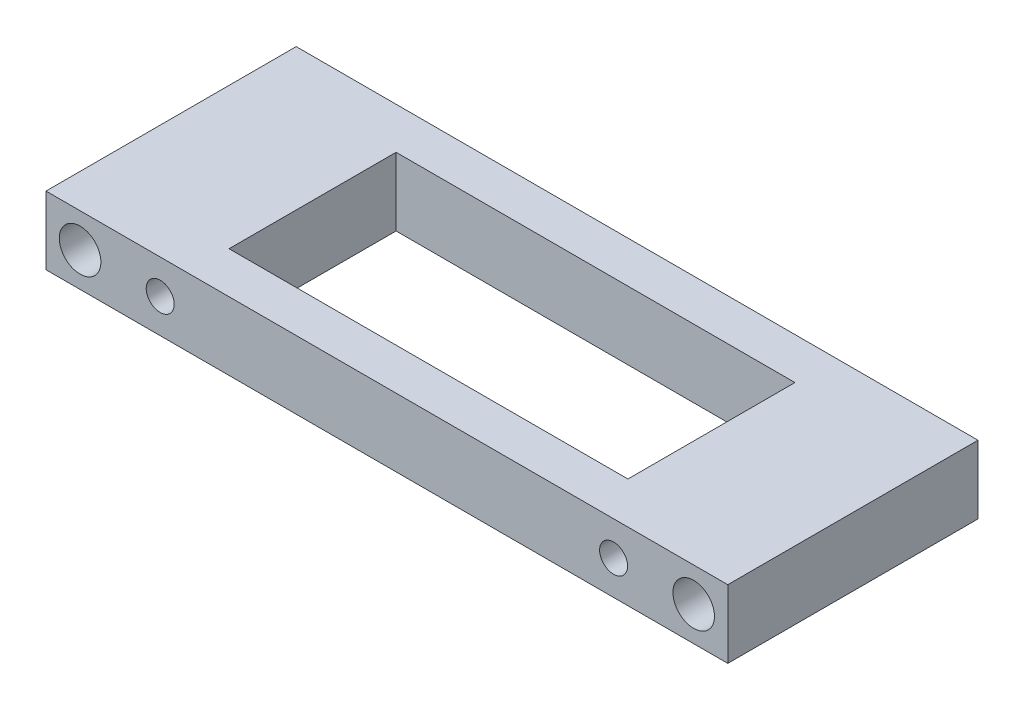
ISO-10303-21;
HEADER;
FILE_DESCRIPTION(('STEP AP214'),'2;1');
FILE_NAME('part.step','',(''),(''),'','','');
FILE_SCHEMA(('AUTOMOTIVE_DESIGN { 1 0 10303 214 1 1 1 1 }'));
ENDSEC;
DATA;
#1=APPLICATION_CONTEXT('core data for automotive mechanical design processes');
#2=APPLICATION_PROTOCOL_DEFINITION('international standard','automotive_design',2000,#1);
#3=PRODUCT_CONTEXT('',#1,'mechanical');
#4=PRODUCT('Part','Part','',(#3));
#5=PRODUCT_RELATED_PRODUCT_CATEGORY('part','',(#4));
#6=PRODUCT_DEFINITION_FORMATION('','',#4);
#7=PRODUCT_DEFINITION_CONTEXT('part definition',#1,'design');
#8=PRODUCT_DEFINITION('design','',#6,#7);
#9=PRODUCT_DEFINITION_SHAPE('','',#8);
#10=(LENGTH_UNIT() NAMED_UNIT(*) SI_UNIT(.MILLI.,.METRE.));
#11=(NAMED_UNIT(*) PLANE_ANGLE_UNIT() SI_UNIT($,.RADIAN.));
#12=(NAMED_UNIT(*) SI_UNIT($,.STERADIAN.) SOLID_ANGLE_UNIT());
#13=UNCERTAINTY_MEASURE_WITH_UNIT(LENGTH_MEASURE(1.E-05),#10,'distance_accuracy_value','');
#14=(GEOMETRIC_REPRESENTATION_CONTEXT(3) GLOBAL_UNCERTAINTY_ASSIGNED_CONTEXT((#13)) GLOBAL_UNIT_ASSIGNED_CONTEXT((#10,
#11,#12)) REPRESENTATION_CONTEXT('',''));
#15=CARTESIAN_POINT('',(0.,0.,0.));
#16=DIRECTION('',(0.,0.,1.));
#17=DIRECTION('',(1.,0.,0.));
#18=AXIS2_PLACEMENT_3D('',#15,#16,#17);
#19=CARTESIAN_POINT('',(0.,20.,40.));
#20=DIRECTION('',(0.,-1.,0.));
#21=DIRECTION('',(1.,0.,0.));
#22=AXIS2_PLACEMENT_3D('',#19,#20,#21);
#23=PLANE('',#22);
#24=DIRECTION('',(0.,0.,-1.));
#25=VECTOR('',#24,1.);
#26=CARTESIAN_POINT('',(100.,20.,40.));
#27=LINE('',#26,#25);
#28=CARTESIAN_POINT('',(100.,20.,40.));
#29=VERTEX_POINT('',#28);
#30=CARTESIAN_POINT('',(100.,20.,-33.4));
#31=VERTEX_POINT('',#30);
#32=EDGE_CURVE('E145',#29,#31,#27,.T.);
#33=ORIENTED_EDGE('',*,*,#32,.T.);
#34=DIRECTION('',(1.,0.,0.));
#35=VECTOR('',#34,1.);
#36=CARTESIAN_POINT('',(-100.,20.,-33.4));
#37=LINE('',#36,#35);
#38=CARTESIAN_POINT('',(-100.,20.,-33.4));
#39=VERTEX_POINT('',#38);
#40=EDGE_CURVE('E164',#39,#31,#37,.T.);
#41=ORIENTED_EDGE('',*,*,#40,.F.);
#42=DIRECTION('',(0.,0.,-1.));
#43=VECTOR('',#42,1.);
#44=CARTESIAN_POINT('',(-100.,20.,40.));
#45=LINE('',#44,#43);
#46=CARTESIAN_POINT('',(-100.,20.,40.));
#47=VERTEX_POINT('',#46);
#48=EDGE_CURVE('E11',#47,#39,#45,.T.);
#49=ORIENTED_EDGE('',*,*,#48,.F.);
#50=DIRECTION('',(-1.,0.,0.));
#51=VECTOR('',#50,1.);
#52=CARTESIAN_POINT('',(0.,20.,40.));
#53=LINE('',#52,#51);
#54=EDGE_CURVE('E179',#29,#47,#53,.T.);
#55=ORIENTED_EDGE('',*,*,#54,.F.);
#56=EDGE_LOOP('',(#33,#41,#49,#55));
#57=FACE_BOUND('',#56,.T.);
#58=DIRECTION('',(-1.,0.,0.));
#59=VECTOR('',#58,1.);
#60=CARTESIAN_POINT('',(0.,20.,-21.2));
#61=LINE('',#60,#59);
#62=CARTESIAN_POINT('',(58.5,20.,-21.2));
#63=VERTEX_POINT('',#62);
#64=CARTESIAN_POINT('',(-58.5,20.,-21.2));
#65=VERTEX_POINT('',#64);
#66=EDGE_CURVE('E153',#63,#65,#61,.T.);
#67=ORIENTED_EDGE('',*,*,#66,.F.);
#68=DIRECTION('',(0.,0.,1.));
#69=VECTOR('',#68,1.);
#70=CARTESIAN_POINT('',(58.5,20.,-21.2));
#71=LINE('',#70,#69);
#72=CARTESIAN_POINT('',(58.5,20.,27.8));
#73=VERTEX_POINT('',#72);
#74=EDGE_CURVE('E117',#63,#73,#71,.T.);
#75=ORIENTED_EDGE('',*,*,#74,.T.);
#76=DIRECTION('',(1.,0.,0.));
#77=VECTOR('',#76,1.);
#78=CARTESIAN_POINT('',(0.,20.,27.8));
#79=LINE('',#78,#77);
#80=CARTESIAN_POINT('',(-58.5,20.,27.8));
#81=VERTEX_POINT('',#80);
#82=EDGE_CURVE('E158',#81,#73,#79,.T.);
#83=ORIENTED_EDGE('',*,*,#82,.F.);
#84=DIRECTION('',(0.,0.,1.));
#85=VECTOR('',#84,1.);
#86=CARTESIAN_POINT('',(-58.5,20.,-21.2));
#87=LINE('',#86,#85);
#88=EDGE_CURVE('E155',#65,#81,#87,.T.);
#89=ORIENTED_EDGE('',*,*,#88,.F.);
#90=EDGE_LOOP('',(#67,#75,#83,#89));
#91=FACE_BOUND('',#90,.T.);
#92=ADVANCED_FACE('F35',(#57,#91),#23,.F.);
#93=CARTESIAN_POINT('',(0.,0.,40.));
#94=DIRECTION('',(0.,1.,0.));
#95=DIRECTION('',(0.,0.,1.));
#96=AXIS2_PLACEMENT_3D('',#93,#94,#95);
#97=PLANE('',#96);
#98=DIRECTION('',(-1.,0.,0.));
#99=VECTOR('',#98,1.);
#100=CARTESIAN_POINT('',(-100.,0.,-33.4));
#101=LINE('',#100,#99);
#102=CARTESIAN_POINT('',(100.,0.,-33.4));
#103=VERTEX_POINT('',#102);
#104=CARTESIAN_POINT('',(-100.,0.,-33.4));
#105=VERTEX_POINT('',#104);
#106=EDGE_CURVE('E166',#103,#105,#101,.T.);
#107=ORIENTED_EDGE('',*,*,#106,.F.);
#108=DIRECTION('',(0.,0.,-1.));
#109=VECTOR('',#108,1.);
#110=CARTESIAN_POINT('',(100.,0.,40.));
#111=LINE('',#110,#109);
#112=CARTESIAN_POINT('',(100.,0.,40.));
#113=VERTEX_POINT('',#112);
#114=EDGE_CURVE('E148',#113,#103,#111,.T.);
#115=ORIENTED_EDGE('',*,*,#114,.F.);
#116=DIRECTION('',(1.,0.,0.));
#117=VECTOR('',#116,1.);
#118=CARTESIAN_POINT('',(0.,0.,40.));
#119=LINE('',#118,#117);
#120=CARTESIAN_POINT('',(-100.,0.,40.));
#121=VERTEX_POINT('',#120);
#122=EDGE_CURVE('E184',#121,#113,#119,.T.);
#123=ORIENTED_EDGE('',*,*,#122,.F.);
#124=DIRECTION('',(0.,0.,-1.));
#125=VECTOR('',#124,1.);
#126=CARTESIAN_POINT('',(-100.,0.,40.));
#127=LINE('',#126,#125);
#128=EDGE_CURVE('E42',#121,#105,#127,.T.);
#129=ORIENTED_EDGE('',*,*,#128,.T.);
#130=EDGE_LOOP('',(#107,#115,#123,#129));
#131=FACE_BOUND('',#130,.T.);
#132=DIRECTION('',(0.,0.,-1.));
#133=VECTOR('',#132,1.);
#134=CARTESIAN_POINT('',(58.5,0.,-21.2));
#135=LINE('',#134,#133);
#136=CARTESIAN_POINT('',(58.5,0.,27.8));
#137=VERTEX_POINT('',#136);
#138=CARTESIAN_POINT('',(58.5,0.,-21.2));
#139=VERTEX_POINT('',#138);
#140=EDGE_CURVE('E114',#137,#139,#135,.T.);
#141=ORIENTED_EDGE('',*,*,#140,.T.);
#142=DIRECTION('',(1.,0.,0.));
#143=VECTOR('',#142,1.);
#144=CARTESIAN_POINT('',(0.,0.,-21.2));
#145=LINE('',#144,#143);
#146=CARTESIAN_POINT('',(-58.5,0.,-21.2));
#147=VERTEX_POINT('',#146);
#148=EDGE_CURVE('E98',#147,#139,#145,.T.);
#149=ORIENTED_EDGE('',*,*,#148,.F.);
#150=DIRECTION('',(0.,0.,-1.));
#151=VECTOR('',#150,1.);
#152=CARTESIAN_POINT('',(-58.5,0.,-21.2));
#153=LINE('',#152,#151);
#154=CARTESIAN_POINT('',(-58.5,0.,27.8));
#155=VERTEX_POINT('',#154);
#156=EDGE_CURVE('E49',#155,#147,#153,.T.);
#157=ORIENTED_EDGE('',*,*,#156,.F.);
#158=DIRECTION('',(-1.,0.,0.));
#159=VECTOR('',#158,1.);
#160=CARTESIAN_POINT('',(0.,0.,27.8));
#161=LINE('',#160,#159);
#162=EDGE_CURVE('E123',#137,#155,#161,.T.);
#163=ORIENTED_EDGE('',*,*,#162,.F.);
#164=EDGE_LOOP('',(#141,#149,#157,#163));
#165=FACE_BOUND('',#164,.T.);
#166=ADVANCED_FACE('F121',(#131,#165),#97,.F.);
#167=CARTESIAN_POINT('',(0.,0.,40.));
#168=DIRECTION('',(0.,0.,1.));
#169=DIRECTION('',(1.,0.,0.));
#170=AXIS2_PLACEMENT_3D('',#167,#168,#169);
#171=PLANE('',#170);
#172=CARTESIAN_POINT('',(-90.,9.99999999999999,40.));
#173=DIRECTION('',(0.,0.,1.));
#174=DIRECTION('',(1.,0.,0.));
#175=AXIS2_PLACEMENT_3D('',#172,#173,#174);
#176=CIRCLE('',#175,6.1);
#177=CARTESIAN_POINT('',(-83.9,9.99999999999999,40.));
#178=VERTEX_POINT('',#177);
#179=EDGE_CURVE('E176',#178,#178,#176,.T.);
#180=ORIENTED_EDGE('',*,*,#179,.F.);
#181=EDGE_LOOP('',(#180));
#182=FACE_BOUND('',#181,.T.);
#183=ORIENTED_EDGE('',*,*,#122,.T.);
#184=DIRECTION('',(0.,-1.,0.));
#185=VECTOR('',#184,1.);
#186=CARTESIAN_POINT('',(100.,0.,40.));
#187=LINE('',#186,#185);
#188=EDGE_CURVE('E142',#29,#113,#187,.T.);
#189=ORIENTED_EDGE('',*,*,#188,.F.);
#190=ORIENTED_EDGE('',*,*,#54,.T.);
#191=DIRECTION('',(0.,-1.,0.));
#192=VECTOR('',#191,1.);
#193=CARTESIAN_POINT('',(-100.,0.,40.));
#194=LINE('',#193,#192);
#195=EDGE_CURVE('E57',#47,#121,#194,.T.);
#196=ORIENTED_EDGE('',*,*,#195,.T.);
#197=EDGE_LOOP('',(#183,#189,#190,#196));
#198=FACE_BOUND('',#197,.T.);
#199=CARTESIAN_POINT('',(-66.5,9.99999999999999,40.));
#200=DIRECTION('',(0.,0.,1.));
#201=DIRECTION('',(1.,0.,0.));
#202=AXIS2_PLACEMENT_3D('',#199,#200,#201);
#203=CIRCLE('',#202,4.1);
#204=CARTESIAN_POINT('',(-62.4,9.99999999999999,40.));
#205=VERTEX_POINT('',#204);
#206=EDGE_CURVE('E170',#205,#205,#203,.T.);
#207=ORIENTED_EDGE('',*,*,#206,.F.);
#208=EDGE_LOOP('',(#207));
#209=FACE_BOUND('',#208,.T.);
#210=CARTESIAN_POINT('',(66.5,9.99999999999999,40.));
#211=DIRECTION('',(0.,0.,-1.));
#212=DIRECTION('',(-1.,0.,0.));
#213=AXIS2_PLACEMENT_3D('',#210,#211,#212);
#214=CIRCLE('',#213,4.1);
#215=CARTESIAN_POINT('',(62.4,9.99999999999999,40.));
#216=VERTEX_POINT('',#215);
#217=EDGE_CURVE('E136',#216,#216,#214,.T.);
#218=ORIENTED_EDGE('',*,*,#217,.T.);
#219=EDGE_LOOP('',(#218));
#220=FACE_BOUND('',#219,.T.);
#221=CARTESIAN_POINT('',(90.,9.99999999999999,40.));
#222=DIRECTION('',(0.,0.,-1.));
#223=DIRECTION('',(-1.,0.,0.));
#224=AXIS2_PLACEMENT_3D('',#221,#222,#223);
#225=CIRCLE('',#224,6.1);
#226=CARTESIAN_POINT('',(83.9,9.99999999999999,40.));
#227=VERTEX_POINT('',#226);
#228=EDGE_CURVE('E139',#227,#227,#225,.T.);
#229=ORIENTED_EDGE('',*,*,#228,.T.);
#230=EDGE_LOOP('',(#229));
#231=FACE_BOUND('',#230,.T.);
#232=ADVANCED_FACE('F202',(#182,#198,#209,#220,#231),#171,.T.);
#233=CARTESIAN_POINT('',(-100.,0.,40.));
#234=DIRECTION('',(1.,0.,0.));
#235=DIRECTION('',(0.,0.,-1.));
#236=AXIS2_PLACEMENT_3D('',#233,#234,#235);
#237=PLANE('',#236);
#238=ORIENTED_EDGE('',*,*,#48,.T.);
#239=DIRECTION('',(0.,1.,0.));
#240=VECTOR('',#239,1.);
#241=CARTESIAN_POINT('',(-100.,20.,-33.4));
#242=LINE('',#241,#240);
#243=EDGE_CURVE('E107',#105,#39,#242,.T.);
#244=ORIENTED_EDGE('',*,*,#243,.F.);
#245=ORIENTED_EDGE('',*,*,#128,.F.);
#246=ORIENTED_EDGE('',*,*,#195,.F.);
#247=EDGE_LOOP('',(#238,#244,#245,#246));
#248=FACE_BOUND('',#247,.T.);
#249=ADVANCED_FACE('F193',(#248),#237,.F.);
#250=CARTESIAN_POINT('',(-90.,9.99999999999999,40.));
#251=DIRECTION('',(0.,0.,-1.));
#252=DIRECTION('',(-1.,0.,0.));
#253=AXIS2_PLACEMENT_3D('',#250,#251,#252);
#254=CYLINDRICAL_SURFACE('',#253,6.1);
#255=ORIENTED_EDGE('',*,*,#179,.T.);
#256=EDGE_LOOP('',(#255));
#257=FACE_BOUND('',#256,.T.);
#258=CARTESIAN_POINT('',(-90.,9.99999999999999,0.));
#259=DIRECTION('',(0.,0.,1.));
#260=DIRECTION('',(1.,0.,0.));
#261=AXIS2_PLACEMENT_3D('',#258,#259,#260);
#262=CIRCLE('',#261,6.1);
#263=CARTESIAN_POINT('',(-83.9,9.99999999999999,0.));
#264=VERTEX_POINT('',#263);
#265=EDGE_CURVE('E173',#264,#264,#262,.T.);
#266=ORIENTED_EDGE('',*,*,#265,.F.);
#267=EDGE_LOOP('',(#266));
#268=FACE_BOUND('',#267,.T.);
#269=ADVANCED_FACE('F240',(#257,#268),#254,.F.);
#270=CARTESIAN_POINT('',(-66.5,9.99999999999999,40.));
#271=DIRECTION('',(0.,0.,-1.));
#272=DIRECTION('',(-1.,0.,0.));
#273=AXIS2_PLACEMENT_3D('',#270,#271,#272);
#274=CYLINDRICAL_SURFACE('',#273,4.1);
#275=ORIENTED_EDGE('',*,*,#206,.T.);
#276=EDGE_LOOP('',(#275));
#277=FACE_BOUND('',#276,.T.);
#278=CARTESIAN_POINT('',(-66.5,9.99999999999999,0.));
#279=DIRECTION('',(0.,0.,1.));
#280=DIRECTION('',(1.,0.,0.));
#281=AXIS2_PLACEMENT_3D('',#278,#279,#280);
#282=CIRCLE('',#281,4.1);
#283=CARTESIAN_POINT('',(-62.4,9.99999999999999,0.));
#284=VERTEX_POINT('',#283);
#285=EDGE_CURVE('E169',#284,#284,#282,.T.);
#286=ORIENTED_EDGE('',*,*,#285,.F.);
#287=EDGE_LOOP('',(#286));
#288=FACE_BOUND('',#287,.T.);
#289=ADVANCED_FACE('F244',(#277,#288),#274,.F.);
#290=CARTESIAN_POINT('',(0.,0.,0.));
#291=DIRECTION('',(0.,0.,1.));
#292=DIRECTION('',(1.,0.,0.));
#293=AXIS2_PLACEMENT_3D('',#290,#291,#292);
#294=PLANE('',#293);
#295=ORIENTED_EDGE('',*,*,#285,.T.);
#296=EDGE_LOOP('',(#295));
#297=FACE_BOUND('',#296,.T.);
#298=ADVANCED_FACE('F249',(#297),#294,.T.);
#299=ORIENTED_EDGE('',*,*,#265,.T.);
#300=EDGE_LOOP('',(#299));
#301=FACE_BOUND('',#300,.T.);
#302=ADVANCED_FACE('F254',(#301),#294,.T.);
#303=CARTESIAN_POINT('',(0.,0.,-33.4));
#304=DIRECTION('',(0.,0.,1.));
#305=DIRECTION('',(1.,0.,0.));
#306=AXIS2_PLACEMENT_3D('',#303,#304,#305);
#307=PLANE('',#306);
#308=ORIENTED_EDGE('',*,*,#243,.T.);
#309=ORIENTED_EDGE('',*,*,#40,.T.);
#310=DIRECTION('',(0.,1.,0.));
#311=VECTOR('',#310,1.);
#312=CARTESIAN_POINT('',(100.,20.,-33.4));
#313=LINE('',#312,#311);
#314=EDGE_CURVE('E118',#103,#31,#313,.T.);
#315=ORIENTED_EDGE('',*,*,#314,.F.);
#316=ORIENTED_EDGE('',*,*,#106,.T.);
#317=EDGE_LOOP('',(#308,#309,#315,#316));
#318=FACE_BOUND('',#317,.T.);
#319=ADVANCED_FACE('F192',(#318),#307,.F.);
#320=CARTESIAN_POINT('',(0.,-0.001000000000001,27.8));
#321=DIRECTION('',(0.,0.,1.));
#322=DIRECTION('',(1.,0.,0.));
#323=AXIS2_PLACEMENT_3D('',#320,#321,#322);
#324=PLANE('',#323);
#325=ORIENTED_EDGE('',*,*,#162,.T.);
#326=DIRECTION('',(0.,1.,0.));
#327=VECTOR('',#326,1.);
#328=CARTESIAN_POINT('',(-58.5,-0.00100000000000794,27.8));
#329=LINE('',#328,#327);
#330=EDGE_CURVE('E108',#155,#81,#329,.T.);
#331=ORIENTED_EDGE('',*,*,#330,.T.);
#332=ORIENTED_EDGE('',*,*,#82,.T.);
#333=DIRECTION('',(0.,1.,0.));
#334=VECTOR('',#333,1.);
#335=CARTESIAN_POINT('',(58.5,-0.00100000000001835,27.8));
#336=LINE('',#335,#334);
#337=EDGE_CURVE('E119',#137,#73,#336,.T.);
#338=ORIENTED_EDGE('',*,*,#337,.F.);
#339=EDGE_LOOP('',(#325,#331,#332,#338));
#340=FACE_BOUND('',#339,.T.);
#341=ADVANCED_FACE('F260',(#340),#324,.F.);
#342=CARTESIAN_POINT('',(-58.5,-0.00100000000000794,-21.2));
#343=DIRECTION('',(-1.,0.,0.));
#344=DIRECTION('',(0.,0.,1.));
#345=AXIS2_PLACEMENT_3D('',#342,#343,#344);
#346=PLANE('',#345);
#347=ORIENTED_EDGE('',*,*,#156,.T.);
#348=DIRECTION('',(0.,1.,0.));
#349=VECTOR('',#348,1.);
#350=CARTESIAN_POINT('',(-58.5,-0.00100000000000794,-21.2));
#351=LINE('',#350,#349);
#352=EDGE_CURVE('E104',#147,#65,#351,.T.);
#353=ORIENTED_EDGE('',*,*,#352,.T.);
#354=ORIENTED_EDGE('',*,*,#88,.T.);
#355=ORIENTED_EDGE('',*,*,#330,.F.);
#356=EDGE_LOOP('',(#347,#353,#354,#355));
#357=FACE_BOUND('',#356,.T.);
#358=ADVANCED_FACE('F263',(#357),#346,.F.);
#359=CARTESIAN_POINT('',(0.,-0.001000000000001,-21.2));
#360=DIRECTION('',(0.,0.,-1.));
#361=DIRECTION('',(-1.,0.,0.));
#362=AXIS2_PLACEMENT_3D('',#359,#360,#361);
#363=PLANE('',#362);
#364=ORIENTED_EDGE('',*,*,#148,.T.);
#365=DIRECTION('',(0.,1.,0.));
#366=VECTOR('',#365,1.);
#367=CARTESIAN_POINT('',(58.5,-0.00100000000001835,-21.2));
#368=LINE('',#367,#366);
#369=EDGE_CURVE('E102',#139,#63,#368,.T.);
#370=ORIENTED_EDGE('',*,*,#369,.T.);
#371=ORIENTED_EDGE('',*,*,#66,.T.);
#372=ORIENTED_EDGE('',*,*,#352,.F.);
#373=EDGE_LOOP('',(#364,#370,#371,#372));
#374=FACE_BOUND('',#373,.T.);
#375=ADVANCED_FACE('F100',(#374),#363,.F.);
#376=CARTESIAN_POINT('',(100.,0.,40.));
#377=DIRECTION('',(1.,0.,0.));
#378=DIRECTION('',(0.,1.,0.));
#379=AXIS2_PLACEMENT_3D('',#376,#377,#378);
#380=PLANE('',#379);
#381=ORIENTED_EDGE('',*,*,#114,.T.);
#382=ORIENTED_EDGE('',*,*,#314,.T.);
#383=ORIENTED_EDGE('',*,*,#32,.F.);
#384=ORIENTED_EDGE('',*,*,#188,.T.);
#385=EDGE_LOOP('',(#381,#382,#383,#384));
#386=FACE_BOUND('',#385,.T.);
#387=ADVANCED_FACE('F201',(#386),#380,.T.);
#388=CARTESIAN_POINT('',(90.,9.99999999999999,40.));
#389=DIRECTION('',(0.,0.,-1.));
#390=DIRECTION('',(-1.,0.,0.));
#391=AXIS2_PLACEMENT_3D('',#388,#389,#390);
#392=CYLINDRICAL_SURFACE('',#391,6.1);
#393=ORIENTED_EDGE('',*,*,#228,.F.);
#394=EDGE_LOOP('',(#393));
#395=FACE_BOUND('',#394,.T.);
#396=CARTESIAN_POINT('',(90.,9.99999999999999,0.));
#397=DIRECTION('',(0.,0.,1.));
#398=DIRECTION('',(1.,0.,0.));
#399=AXIS2_PLACEMENT_3D('',#396,#397,#398);
#400=CIRCLE('',#399,6.1);
#401=CARTESIAN_POINT('',(96.1,9.99999999999999,0.));
#402=VERTEX_POINT('',#401);
#403=EDGE_CURVE('E133',#402,#402,#400,.F.);
#404=ORIENTED_EDGE('',*,*,#403,.T.);
#405=EDGE_LOOP('',(#404));
#406=FACE_BOUND('',#405,.T.);
#407=ADVANCED_FACE('F213',(#395,#406),#392,.F.);
#408=CARTESIAN_POINT('',(66.5,9.99999999999999,40.));
#409=DIRECTION('',(0.,0.,-1.));
#410=DIRECTION('',(-1.,0.,0.));
#411=AXIS2_PLACEMENT_3D('',#408,#409,#410);
#412=CYLINDRICAL_SURFACE('',#411,4.1);
#413=ORIENTED_EDGE('',*,*,#217,.F.);
#414=EDGE_LOOP('',(#413));
#415=FACE_BOUND('',#414,.T.);
#416=CARTESIAN_POINT('',(66.5,9.99999999999999,0.));
#417=DIRECTION('',(0.,0.,1.));
#418=DIRECTION('',(1.,0.,0.));
#419=AXIS2_PLACEMENT_3D('',#416,#417,#418);
#420=CIRCLE('',#419,4.1);
#421=CARTESIAN_POINT('',(70.6,9.99999999999999,0.));
#422=VERTEX_POINT('',#421);
#423=EDGE_CURVE('E130',#422,#422,#420,.F.);
#424=ORIENTED_EDGE('',*,*,#423,.T.);
#425=EDGE_LOOP('',(#424));
#426=FACE_BOUND('',#425,.T.);
#427=ADVANCED_FACE('F216',(#415,#426),#412,.F.);
#428=CARTESIAN_POINT('',(0.,0.,0.));
#429=DIRECTION('',(0.,0.,1.));
#430=DIRECTION('',(-1.,0.,0.));
#431=AXIS2_PLACEMENT_3D('',#428,#429,#430);
#432=PLANE('',#431);
#433=ORIENTED_EDGE('',*,*,#423,.F.);
#434=EDGE_LOOP('',(#433));
#435=FACE_BOUND('',#434,.T.);
#436=ADVANCED_FACE('F222',(#435),#432,.T.);
#437=ORIENTED_EDGE('',*,*,#403,.F.);
#438=EDGE_LOOP('',(#437));
#439=FACE_BOUND('',#438,.T.);
#440=ADVANCED_FACE('F220',(#439),#432,.T.);
#441=CARTESIAN_POINT('',(58.5,-0.00100000000001835,-21.2));
#442=DIRECTION('',(-1.,0.,0.));
#443=DIRECTION('',(0.,0.,1.));
#444=AXIS2_PLACEMENT_3D('',#441,#442,#443);
#445=PLANE('',#444);
#446=ORIENTED_EDGE('',*,*,#337,.T.);
#447=ORIENTED_EDGE('',*,*,#74,.F.);
#448=ORIENTED_EDGE('',*,*,#369,.F.);
#449=ORIENTED_EDGE('',*,*,#140,.F.);
#450=EDGE_LOOP('',(#446,#447,#448,#449));
#451=FACE_BOUND('',#450,.T.);
#452=ADVANCED_FACE('F113',(#451),#445,.T.);
#453=CLOSED_SHELL('',(#92,#166,#232,#249,#269,#289,#298,#302,#319,#341,#358,#375,#387,#407,#427,
#436,#440,#452));
#454=MANIFOLD_SOLID_BREP('B2',#453);
#455=ADVANCED_BREP_SHAPE_REPRESENTATION('',(#18,#454),#14);
#456=SHAPE_DEFINITION_REPRESENTATION(#9,#455);
ENDSEC;
END-ISO-10303-21;
